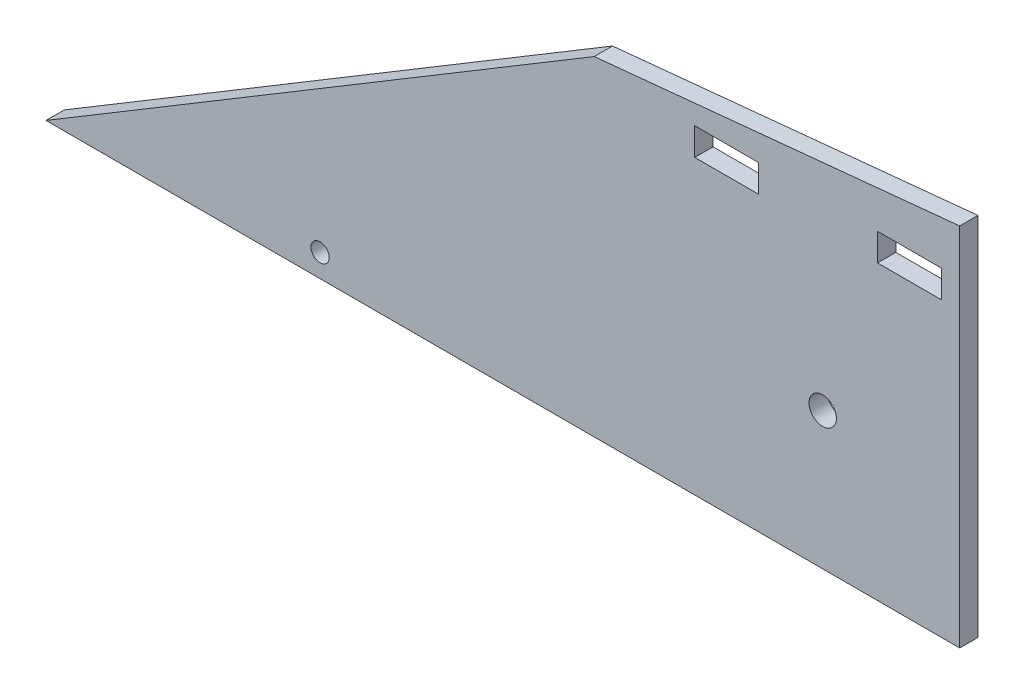
ISO-10303-21;
HEADER;
FILE_DESCRIPTION(('STEP AP214'),'2;1');
FILE_NAME('part.step','',(''),(''),'','','');
FILE_SCHEMA(('AUTOMOTIVE_DESIGN { 1 0 10303 214 1 1 1 1 }'));
ENDSEC;
DATA;
#1=APPLICATION_CONTEXT('core data for automotive mechanical design processes');
#2=APPLICATION_PROTOCOL_DEFINITION('international standard','automotive_design',2000,#1);
#3=PRODUCT_CONTEXT('',#1,'mechanical');
#4=PRODUCT('Part','Part','',(#3));
#5=PRODUCT_RELATED_PRODUCT_CATEGORY('part','',(#4));
#6=PRODUCT_DEFINITION_FORMATION('','',#4);
#7=PRODUCT_DEFINITION_CONTEXT('part definition',#1,'design');
#8=PRODUCT_DEFINITION('design','',#6,#7);
#9=PRODUCT_DEFINITION_SHAPE('','',#8);
#10=(LENGTH_UNIT() NAMED_UNIT(*) SI_UNIT(.MILLI.,.METRE.));
#11=(NAMED_UNIT(*) PLANE_ANGLE_UNIT() SI_UNIT($,.RADIAN.));
#12=(NAMED_UNIT(*) SI_UNIT($,.STERADIAN.) SOLID_ANGLE_UNIT());
#13=UNCERTAINTY_MEASURE_WITH_UNIT(LENGTH_MEASURE(1.E-05),#10,'distance_accuracy_value','');
#14=(GEOMETRIC_REPRESENTATION_CONTEXT(3) GLOBAL_UNCERTAINTY_ASSIGNED_CONTEXT((#13)) GLOBAL_UNIT_ASSIGNED_CONTEXT((#10,
#11,#12)) REPRESENTATION_CONTEXT('',''));
#15=CARTESIAN_POINT('',(0.,0.,0.));
#16=DIRECTION('',(0.,0.,1.));
#17=DIRECTION('',(1.,0.,0.));
#18=AXIS2_PLACEMENT_3D('',#15,#16,#17);
#19=CARTESIAN_POINT('',(61.3646568793058,600.925212577331,20.));
#20=DIRECTION('',(0.,0.,-1.));
#21=DIRECTION('',(-1.,0.,0.));
#22=AXIS2_PLACEMENT_3D('',#19,#20,#21);
#23=PLANE('',#22);
#24=CARTESIAN_POINT('',(-638.635343120694,25.,20.));
#25=DIRECTION('',(0.,0.,-1.));
#26=DIRECTION('',(-1.,0.,0.));
#27=AXIS2_PLACEMENT_3D('',#24,#25,#26);
#28=CIRCLE('',#27,9.99999999999998);
#29=CARTESIAN_POINT('',(-648.635343120694,25.,20.));
#30=VERTEX_POINT('',#29);
#31=EDGE_CURVE('E156',#30,#30,#28,.T.);
#32=ORIENTED_EDGE('',*,*,#31,.T.);
#33=EDGE_LOOP('',(#32));
#34=FACE_BOUND('',#33,.T.);
#35=CARTESIAN_POINT('',(-88.6353431206942,150.,20.));
#36=DIRECTION('',(0.,0.,-1.));
#37=DIRECTION('',(-1.,0.,0.));
#38=AXIS2_PLACEMENT_3D('',#35,#36,#37);
#39=CIRCLE('',#38,15.);
#40=CARTESIAN_POINT('',(-103.635343120694,150.,20.));
#41=VERTEX_POINT('',#40);
#42=EDGE_CURVE('E196',#41,#41,#39,.T.);
#43=ORIENTED_EDGE('',*,*,#42,.T.);
#44=EDGE_LOOP('',(#43));
#45=FACE_BOUND('',#44,.T.);
#46=DIRECTION('',(-0.857142857142857,-0.515078753637713,0.));
#47=VECTOR('',#46,1.);
#48=CARTESIAN_POINT('',(-338.635343120694,360.555127546399,20.));
#49=LINE('',#48,#47);
#50=CARTESIAN_POINT('',(-338.635343120694,360.555127546399,20.));
#51=VERTEX_POINT('',#50);
#52=CARTESIAN_POINT('',(-938.635343120694,0.,20.));
#53=VERTEX_POINT('',#52);
#54=EDGE_CURVE('E200',#51,#53,#49,.T.);
#55=ORIENTED_EDGE('',*,*,#54,.T.);
#56=DIRECTION('',(1.,0.,0.));
#57=VECTOR('',#56,1.);
#58=CARTESIAN_POINT('',(-938.635343120694,0.,20.));
#59=LINE('',#58,#57);
#60=CARTESIAN_POINT('',(61.3646568793058,0.,20.));
#61=VERTEX_POINT('',#60);
#62=EDGE_CURVE('E203',#53,#61,#59,.T.);
#63=ORIENTED_EDGE('',*,*,#62,.T.);
#64=DIRECTION('',(0.,1.,0.));
#65=VECTOR('',#64,1.);
#66=CARTESIAN_POINT('',(61.3646568793058,0.,20.));
#67=LINE('',#66,#65);
#68=CARTESIAN_POINT('',(61.3646568793058,400.,20.));
#69=VERTEX_POINT('',#68);
#70=EDGE_CURVE('E206',#61,#69,#67,.T.);
#71=ORIENTED_EDGE('',*,*,#70,.T.);
#72=DIRECTION('',(-0.995172995133295,-0.0981361796557527,0.));
#73=VECTOR('',#72,1.);
#74=CARTESIAN_POINT('',(61.3646568793058,400.,20.));
#75=LINE('',#74,#73);
#76=EDGE_CURVE('E208',#69,#51,#75,.T.);
#77=ORIENTED_EDGE('',*,*,#76,.T.);
#78=EDGE_LOOP('',(#55,#63,#71,#77));
#79=FACE_BOUND('',#78,.T.);
#80=DIRECTION('',(1.,0.,0.));
#81=VECTOR('',#80,1.);
#82=CARTESIAN_POINT('',(-158.635343120694,350.,20.));
#83=LINE('',#82,#81);
#84=CARTESIAN_POINT('',(-228.635343120694,350.,20.));
#85=VERTEX_POINT('',#84);
#86=CARTESIAN_POINT('',(-158.635343120694,350.,20.));
#87=VERTEX_POINT('',#86);
#88=EDGE_CURVE('E165',#85,#87,#83,.T.);
#89=ORIENTED_EDGE('',*,*,#88,.T.);
#90=DIRECTION('',(0.,-1.,0.));
#91=VECTOR('',#90,1.);
#92=CARTESIAN_POINT('',(-158.635343120694,320.,20.));
#93=LINE('',#92,#91);
#94=CARTESIAN_POINT('',(-158.635343120694,320.,20.));
#95=VERTEX_POINT('',#94);
#96=EDGE_CURVE('E161',#87,#95,#93,.T.);
#97=ORIENTED_EDGE('',*,*,#96,.T.);
#98=DIRECTION('',(-1.,0.,0.));
#99=VECTOR('',#98,1.);
#100=CARTESIAN_POINT('',(-158.635343120694,320.,20.));
#101=LINE('',#100,#99);
#102=CARTESIAN_POINT('',(-228.635343120694,320.,20.));
#103=VERTEX_POINT('',#102);
#104=EDGE_CURVE('E164',#95,#103,#101,.T.);
#105=ORIENTED_EDGE('',*,*,#104,.T.);
#106=DIRECTION('',(0.,1.,0.));
#107=VECTOR('',#106,1.);
#108=CARTESIAN_POINT('',(-228.635343120694,320.,20.));
#109=LINE('',#108,#107);
#110=EDGE_CURVE('E168',#103,#85,#109,.T.);
#111=ORIENTED_EDGE('',*,*,#110,.T.);
#112=EDGE_LOOP('',(#89,#97,#105,#111));
#113=FACE_BOUND('',#112,.T.);
#114=DIRECTION('',(-1.,0.,0.));
#115=VECTOR('',#114,1.);
#116=CARTESIAN_POINT('',(-28.6353431206942,320.,20.));
#117=LINE('',#116,#115);
#118=CARTESIAN_POINT('',(41.3646568793058,320.,20.));
#119=VERTEX_POINT('',#118);
#120=CARTESIAN_POINT('',(-28.6353431206942,320.,20.));
#121=VERTEX_POINT('',#120);
#122=EDGE_CURVE('E149',#119,#121,#117,.T.);
#123=ORIENTED_EDGE('',*,*,#122,.T.);
#124=DIRECTION('',(0.,1.,0.));
#125=VECTOR('',#124,1.);
#126=CARTESIAN_POINT('',(-28.6353431206942,320.,20.));
#127=LINE('',#126,#125);
#128=CARTESIAN_POINT('',(-28.6353431206942,350.,20.));
#129=VERTEX_POINT('',#128);
#130=EDGE_CURVE('E152',#121,#129,#127,.T.);
#131=ORIENTED_EDGE('',*,*,#130,.T.);
#132=DIRECTION('',(1.,0.,0.));
#133=VECTOR('',#132,1.);
#134=CARTESIAN_POINT('',(-28.6353431206942,350.,20.));
#135=LINE('',#134,#133);
#136=CARTESIAN_POINT('',(41.3646568793058,350.,20.));
#137=VERTEX_POINT('',#136);
#138=EDGE_CURVE('E123',#129,#137,#135,.T.);
#139=ORIENTED_EDGE('',*,*,#138,.T.);
#140=DIRECTION('',(0.,-1.,0.));
#141=VECTOR('',#140,1.);
#142=CARTESIAN_POINT('',(41.3646568793058,320.,20.));
#143=LINE('',#142,#141);
#144=EDGE_CURVE('E157',#137,#119,#143,.T.);
#145=ORIENTED_EDGE('',*,*,#144,.T.);
#146=EDGE_LOOP('',(#123,#131,#139,#145));
#147=FACE_BOUND('',#146,.T.);
#148=ADVANCED_FACE('F31',(#34,#45,#79,#113,#147),#23,.F.);
#149=CARTESIAN_POINT('',(61.3646568793058,600.925212577331,0.));
#150=DIRECTION('',(0.,0.,-1.));
#151=DIRECTION('',(-1.,0.,0.));
#152=AXIS2_PLACEMENT_3D('',#149,#150,#151);
#153=PLANE('',#152);
#154=CARTESIAN_POINT('',(-638.635343120694,25.,0.));
#155=DIRECTION('',(0.,0.,1.));
#156=DIRECTION('',(1.,0.,0.));
#157=AXIS2_PLACEMENT_3D('',#154,#155,#156);
#158=CIRCLE('',#157,9.99999999999998);
#159=CARTESIAN_POINT('',(-628.635343120694,25.,0.));
#160=VERTEX_POINT('',#159);
#161=EDGE_CURVE('E153',#160,#160,#158,.T.);
#162=ORIENTED_EDGE('',*,*,#161,.T.);
#163=EDGE_LOOP('',(#162));
#164=FACE_BOUND('',#163,.T.);
#165=CARTESIAN_POINT('',(-88.6353431206942,150.,0.));
#166=DIRECTION('',(0.,0.,1.));
#167=DIRECTION('',(1.,0.,0.));
#168=AXIS2_PLACEMENT_3D('',#165,#166,#167);
#169=CIRCLE('',#168,15.);
#170=CARTESIAN_POINT('',(-73.6353431206942,150.,0.));
#171=VERTEX_POINT('',#170);
#172=EDGE_CURVE('E171',#171,#171,#169,.T.);
#173=ORIENTED_EDGE('',*,*,#172,.T.);
#174=EDGE_LOOP('',(#173));
#175=FACE_BOUND('',#174,.T.);
#176=DIRECTION('',(-0.857142857142857,-0.515078753637713,0.));
#177=VECTOR('',#176,1.);
#178=CARTESIAN_POINT('',(-338.635343120694,360.555127546399,0.));
#179=LINE('',#178,#177);
#180=CARTESIAN_POINT('',(-338.635343120694,360.555127546399,0.));
#181=VERTEX_POINT('',#180);
#182=CARTESIAN_POINT('',(-938.635343120694,0.,0.));
#183=VERTEX_POINT('',#182);
#184=EDGE_CURVE('E199',#181,#183,#179,.T.);
#185=ORIENTED_EDGE('',*,*,#184,.F.);
#186=DIRECTION('',(-0.995172995133295,-0.0981361796557527,0.));
#187=VECTOR('',#186,1.);
#188=CARTESIAN_POINT('',(61.3646568793058,400.,0.));
#189=LINE('',#188,#187);
#190=CARTESIAN_POINT('',(61.3646568793058,400.,0.));
#191=VERTEX_POINT('',#190);
#192=EDGE_CURVE('E204',#191,#181,#189,.T.);
#193=ORIENTED_EDGE('',*,*,#192,.F.);
#194=DIRECTION('',(0.,1.,0.));
#195=VECTOR('',#194,1.);
#196=CARTESIAN_POINT('',(61.3646568793058,0.,0.));
#197=LINE('',#196,#195);
#198=CARTESIAN_POINT('',(61.3646568793058,0.,0.));
#199=VERTEX_POINT('',#198);
#200=EDGE_CURVE('E215',#199,#191,#197,.T.);
#201=ORIENTED_EDGE('',*,*,#200,.F.);
#202=DIRECTION('',(1.,0.,0.));
#203=VECTOR('',#202,1.);
#204=CARTESIAN_POINT('',(-938.635343120694,0.,0.));
#205=LINE('',#204,#203);
#206=EDGE_CURVE('E213',#183,#199,#205,.T.);
#207=ORIENTED_EDGE('',*,*,#206,.F.);
#208=EDGE_LOOP('',(#185,#193,#201,#207));
#209=FACE_BOUND('',#208,.T.);
#210=DIRECTION('',(0.,1.,0.));
#211=VECTOR('',#210,1.);
#212=CARTESIAN_POINT('',(-158.635343120694,320.,0.));
#213=LINE('',#212,#211);
#214=CARTESIAN_POINT('',(-158.635343120694,320.,0.));
#215=VERTEX_POINT('',#214);
#216=CARTESIAN_POINT('',(-158.635343120694,350.,0.));
#217=VERTEX_POINT('',#216);
#218=EDGE_CURVE('E177',#215,#217,#213,.T.);
#219=ORIENTED_EDGE('',*,*,#218,.T.);
#220=DIRECTION('',(-1.,0.,0.));
#221=VECTOR('',#220,1.);
#222=CARTESIAN_POINT('',(-158.635343120694,350.,0.));
#223=LINE('',#222,#221);
#224=CARTESIAN_POINT('',(-228.635343120694,350.,0.));
#225=VERTEX_POINT('',#224);
#226=EDGE_CURVE('E180',#217,#225,#223,.T.);
#227=ORIENTED_EDGE('',*,*,#226,.T.);
#228=DIRECTION('',(0.,-1.,0.));
#229=VECTOR('',#228,1.);
#230=CARTESIAN_POINT('',(-228.635343120694,320.,0.));
#231=LINE('',#230,#229);
#232=CARTESIAN_POINT('',(-228.635343120694,320.,0.));
#233=VERTEX_POINT('',#232);
#234=EDGE_CURVE('E160',#225,#233,#231,.T.);
#235=ORIENTED_EDGE('',*,*,#234,.T.);
#236=DIRECTION('',(1.,0.,0.));
#237=VECTOR('',#236,1.);
#238=CARTESIAN_POINT('',(-158.635343120694,320.,0.));
#239=LINE('',#238,#237);
#240=EDGE_CURVE('E174',#233,#215,#239,.T.);
#241=ORIENTED_EDGE('',*,*,#240,.T.);
#242=EDGE_LOOP('',(#219,#227,#235,#241));
#243=FACE_BOUND('',#242,.T.);
#244=DIRECTION('',(0.,-1.,0.));
#245=VECTOR('',#244,1.);
#246=CARTESIAN_POINT('',(-28.6353431206942,320.,0.));
#247=LINE('',#246,#245);
#248=CARTESIAN_POINT('',(-28.6353431206942,350.,0.));
#249=VERTEX_POINT('',#248);
#250=CARTESIAN_POINT('',(-28.6353431206942,320.,0.));
#251=VERTEX_POINT('',#250);
#252=EDGE_CURVE('E130',#249,#251,#247,.T.);
#253=ORIENTED_EDGE('',*,*,#252,.T.);
#254=DIRECTION('',(1.,0.,0.));
#255=VECTOR('',#254,1.);
#256=CARTESIAN_POINT('',(-28.6353431206942,320.,0.));
#257=LINE('',#256,#255);
#258=CARTESIAN_POINT('',(41.3646568793058,320.,0.));
#259=VERTEX_POINT('',#258);
#260=EDGE_CURVE('E136',#251,#259,#257,.T.);
#261=ORIENTED_EDGE('',*,*,#260,.T.);
#262=DIRECTION('',(0.,1.,0.));
#263=VECTOR('',#262,1.);
#264=CARTESIAN_POINT('',(41.3646568793058,320.,0.));
#265=LINE('',#264,#263);
#266=CARTESIAN_POINT('',(41.3646568793058,350.,0.));
#267=VERTEX_POINT('',#266);
#268=EDGE_CURVE('E140',#259,#267,#265,.T.);
#269=ORIENTED_EDGE('',*,*,#268,.T.);
#270=DIRECTION('',(-1.,0.,0.));
#271=VECTOR('',#270,1.);
#272=CARTESIAN_POINT('',(-28.6353431206942,350.,0.));
#273=LINE('',#272,#271);
#274=EDGE_CURVE('E54',#267,#249,#273,.T.);
#275=ORIENTED_EDGE('',*,*,#274,.T.);
#276=EDGE_LOOP('',(#253,#261,#269,#275));
#277=FACE_BOUND('',#276,.T.);
#278=ADVANCED_FACE('F139',(#164,#175,#209,#243,#277),#153,.T.);
#279=CARTESIAN_POINT('',(-338.635343120694,360.555127546399,20.));
#280=DIRECTION('',(0.515078753637713,-0.857142857142857,0.));
#281=DIRECTION('',(0.857142857142857,0.515078753637713,0.));
#282=AXIS2_PLACEMENT_3D('',#279,#280,#281);
#283=PLANE('',#282);
#284=ORIENTED_EDGE('',*,*,#184,.T.);
#285=DIRECTION('',(0.,0.,-1.));
#286=VECTOR('',#285,1.);
#287=CARTESIAN_POINT('',(-938.635343120694,0.,20.));
#288=LINE('',#287,#286);
#289=EDGE_CURVE('E11',#53,#183,#288,.T.);
#290=ORIENTED_EDGE('',*,*,#289,.F.);
#291=ORIENTED_EDGE('',*,*,#54,.F.);
#292=DIRECTION('',(0.,0.,-1.));
#293=VECTOR('',#292,1.);
#294=CARTESIAN_POINT('',(-338.635343120694,360.555127546399,20.));
#295=LINE('',#294,#293);
#296=EDGE_CURVE('E210',#51,#181,#295,.T.);
#297=ORIENTED_EDGE('',*,*,#296,.T.);
#298=EDGE_LOOP('',(#284,#290,#291,#297));
#299=FACE_BOUND('',#298,.T.);
#300=ADVANCED_FACE('F33',(#299),#283,.F.);
#301=CARTESIAN_POINT('',(-938.635343120694,0.,20.));
#302=DIRECTION('',(0.,1.,0.));
#303=DIRECTION('',(0.,0.,1.));
#304=AXIS2_PLACEMENT_3D('',#301,#302,#303);
#305=PLANE('',#304);
#306=ORIENTED_EDGE('',*,*,#206,.T.);
#307=DIRECTION('',(0.,0.,-1.));
#308=VECTOR('',#307,1.);
#309=CARTESIAN_POINT('',(61.3646568793058,0.,20.));
#310=LINE('',#309,#308);
#311=EDGE_CURVE('E39',#61,#199,#310,.T.);
#312=ORIENTED_EDGE('',*,*,#311,.F.);
#313=ORIENTED_EDGE('',*,*,#62,.F.);
#314=ORIENTED_EDGE('',*,*,#289,.T.);
#315=EDGE_LOOP('',(#306,#312,#313,#314));
#316=FACE_BOUND('',#315,.T.);
#317=ADVANCED_FACE('F243',(#316),#305,.F.);
#318=CARTESIAN_POINT('',(61.3646568793058,0.,20.));
#319=DIRECTION('',(-1.,0.,0.));
#320=DIRECTION('',(0.,0.,1.));
#321=AXIS2_PLACEMENT_3D('',#318,#319,#320);
#322=PLANE('',#321);
#323=ORIENTED_EDGE('',*,*,#200,.T.);
#324=DIRECTION('',(0.,0.,-1.));
#325=VECTOR('',#324,1.);
#326=CARTESIAN_POINT('',(61.3646568793058,400.,20.));
#327=LINE('',#326,#325);
#328=EDGE_CURVE('E220',#69,#191,#327,.T.);
#329=ORIENTED_EDGE('',*,*,#328,.F.);
#330=ORIENTED_EDGE('',*,*,#70,.F.);
#331=ORIENTED_EDGE('',*,*,#311,.T.);
#332=EDGE_LOOP('',(#323,#329,#330,#331));
#333=FACE_BOUND('',#332,.T.);
#334=ADVANCED_FACE('F227',(#333),#322,.F.);
#335=CARTESIAN_POINT('',(61.3646568793058,400.,20.));
#336=DIRECTION('',(0.0981361796557527,-0.995172995133295,0.));
#337=DIRECTION('',(0.995172995133295,0.0981361796557528,0.));
#338=AXIS2_PLACEMENT_3D('',#335,#336,#337);
#339=PLANE('',#338);
#340=ORIENTED_EDGE('',*,*,#192,.T.);
#341=ORIENTED_EDGE('',*,*,#296,.F.);
#342=ORIENTED_EDGE('',*,*,#76,.F.);
#343=ORIENTED_EDGE('',*,*,#328,.T.);
#344=EDGE_LOOP('',(#340,#341,#342,#343));
#345=FACE_BOUND('',#344,.T.);
#346=ADVANCED_FACE('F236',(#345),#339,.F.);
#347=CARTESIAN_POINT('',(-88.6353431206942,150.,96.1577310586391));
#348=DIRECTION('',(0.,0.,-1.));
#349=DIRECTION('',(-1.,0.,0.));
#350=AXIS2_PLACEMENT_3D('',#347,#348,#349);
#351=CYLINDRICAL_SURFACE('',#350,15.);
#352=ORIENTED_EDGE('',*,*,#42,.F.);
#353=EDGE_LOOP('',(#352));
#354=FACE_BOUND('',#353,.T.);
#355=ORIENTED_EDGE('',*,*,#172,.F.);
#356=EDGE_LOOP('',(#355));
#357=FACE_BOUND('',#356,.T.);
#358=ADVANCED_FACE('F260',(#354,#357),#351,.F.);
#359=CARTESIAN_POINT('',(-158.635343120694,350.,96.1577310586391));
#360=DIRECTION('',(0.,-1.,0.));
#361=DIRECTION('',(0.,0.,-1.));
#362=AXIS2_PLACEMENT_3D('',#359,#360,#361);
#363=PLANE('',#362);
#364=DIRECTION('',(0.,0.,-1.));
#365=VECTOR('',#364,1.);
#366=CARTESIAN_POINT('',(-228.635343120694,350.,96.1577310586391));
#367=LINE('',#366,#365);
#368=EDGE_CURVE('E183',#85,#225,#367,.T.);
#369=ORIENTED_EDGE('',*,*,#368,.T.);
#370=ORIENTED_EDGE('',*,*,#226,.F.);
#371=DIRECTION('',(0.,0.,-1.));
#372=VECTOR('',#371,1.);
#373=CARTESIAN_POINT('',(-158.635343120694,350.,96.1577310586391));
#374=LINE('',#373,#372);
#375=EDGE_CURVE('E185',#87,#217,#374,.T.);
#376=ORIENTED_EDGE('',*,*,#375,.F.);
#377=ORIENTED_EDGE('',*,*,#88,.F.);
#378=EDGE_LOOP('',(#369,#370,#376,#377));
#379=FACE_BOUND('',#378,.T.);
#380=ADVANCED_FACE('F267',(#379),#363,.T.);
#381=CARTESIAN_POINT('',(-158.635343120694,320.,96.1577310586391));
#382=DIRECTION('',(-1.,0.,0.));
#383=DIRECTION('',(0.,0.,1.));
#384=AXIS2_PLACEMENT_3D('',#381,#382,#383);
#385=PLANE('',#384);
#386=ORIENTED_EDGE('',*,*,#375,.T.);
#387=ORIENTED_EDGE('',*,*,#218,.F.);
#388=DIRECTION('',(0.,0.,-1.));
#389=VECTOR('',#388,1.);
#390=CARTESIAN_POINT('',(-158.635343120694,320.,96.1577310586391));
#391=LINE('',#390,#389);
#392=EDGE_CURVE('E187',#95,#215,#391,.T.);
#393=ORIENTED_EDGE('',*,*,#392,.F.);
#394=ORIENTED_EDGE('',*,*,#96,.F.);
#395=EDGE_LOOP('',(#386,#387,#393,#394));
#396=FACE_BOUND('',#395,.T.);
#397=ADVANCED_FACE('F272',(#396),#385,.T.);
#398=CARTESIAN_POINT('',(-158.635343120694,320.,96.1577310586391));
#399=DIRECTION('',(0.,1.,0.));
#400=DIRECTION('',(-1.,0.,0.));
#401=AXIS2_PLACEMENT_3D('',#398,#399,#400);
#402=PLANE('',#401);
#403=ORIENTED_EDGE('',*,*,#392,.T.);
#404=ORIENTED_EDGE('',*,*,#240,.F.);
#405=DIRECTION('',(0.,0.,-1.));
#406=VECTOR('',#405,1.);
#407=CARTESIAN_POINT('',(-228.635343120694,320.,96.1577310586391));
#408=LINE('',#407,#406);
#409=EDGE_CURVE('E189',#103,#233,#408,.T.);
#410=ORIENTED_EDGE('',*,*,#409,.F.);
#411=ORIENTED_EDGE('',*,*,#104,.F.);
#412=EDGE_LOOP('',(#403,#404,#410,#411));
#413=FACE_BOUND('',#412,.T.);
#414=ADVANCED_FACE('F282',(#413),#402,.T.);
#415=CARTESIAN_POINT('',(-228.635343120694,320.,96.1577310586391));
#416=DIRECTION('',(1.,0.,0.));
#417=DIRECTION('',(0.,0.,-1.));
#418=AXIS2_PLACEMENT_3D('',#415,#416,#417);
#419=PLANE('',#418);
#420=ORIENTED_EDGE('',*,*,#409,.T.);
#421=ORIENTED_EDGE('',*,*,#234,.F.);
#422=ORIENTED_EDGE('',*,*,#368,.F.);
#423=ORIENTED_EDGE('',*,*,#110,.F.);
#424=EDGE_LOOP('',(#420,#421,#422,#423));
#425=FACE_BOUND('',#424,.T.);
#426=ADVANCED_FACE('F290',(#425),#419,.T.);
#427=CARTESIAN_POINT('',(-638.635343120694,25.,96.1577310586391));
#428=DIRECTION('',(0.,0.,-1.));
#429=DIRECTION('',(-1.,0.,0.));
#430=AXIS2_PLACEMENT_3D('',#427,#428,#429);
#431=CYLINDRICAL_SURFACE('',#430,9.99999999999998);
#432=ORIENTED_EDGE('',*,*,#31,.F.);
#433=EDGE_LOOP('',(#432));
#434=FACE_BOUND('',#433,.T.);
#435=ORIENTED_EDGE('',*,*,#161,.F.);
#436=EDGE_LOOP('',(#435));
#437=FACE_BOUND('',#436,.T.);
#438=ADVANCED_FACE('F286',(#434,#437),#431,.F.);
#439=CARTESIAN_POINT('',(-28.6353431206942,320.,96.1577310586391));
#440=DIRECTION('',(0.,1.,0.));
#441=DIRECTION('',(0.,0.,1.));
#442=AXIS2_PLACEMENT_3D('',#439,#440,#441);
#443=PLANE('',#442);
#444=DIRECTION('',(0.,0.,-1.));
#445=VECTOR('',#444,1.);
#446=CARTESIAN_POINT('',(41.3646568793058,320.,96.1577310586391));
#447=LINE('',#446,#445);
#448=EDGE_CURVE('E46',#119,#259,#447,.T.);
#449=ORIENTED_EDGE('',*,*,#448,.T.);
#450=ORIENTED_EDGE('',*,*,#260,.F.);
#451=DIRECTION('',(0.,0.,-1.));
#452=VECTOR('',#451,1.);
#453=CARTESIAN_POINT('',(-28.6353431206942,320.,96.1577310586391));
#454=LINE('',#453,#452);
#455=EDGE_CURVE('E127',#121,#251,#454,.T.);
#456=ORIENTED_EDGE('',*,*,#455,.F.);
#457=ORIENTED_EDGE('',*,*,#122,.F.);
#458=EDGE_LOOP('',(#449,#450,#456,#457));
#459=FACE_BOUND('',#458,.T.);
#460=ADVANCED_FACE('F297',(#459),#443,.T.);
#461=CARTESIAN_POINT('',(-28.6353431206942,320.,96.1577310586391));
#462=DIRECTION('',(1.,0.,0.));
#463=DIRECTION('',(0.,0.,-1.));
#464=AXIS2_PLACEMENT_3D('',#461,#462,#463);
#465=PLANE('',#464);
#466=ORIENTED_EDGE('',*,*,#455,.T.);
#467=ORIENTED_EDGE('',*,*,#252,.F.);
#468=DIRECTION('',(0.,0.,-1.));
#469=VECTOR('',#468,1.);
#470=CARTESIAN_POINT('',(-28.6353431206942,350.,96.1577310586391));
#471=LINE('',#470,#469);
#472=EDGE_CURVE('E119',#129,#249,#471,.T.);
#473=ORIENTED_EDGE('',*,*,#472,.F.);
#474=ORIENTED_EDGE('',*,*,#130,.F.);
#475=EDGE_LOOP('',(#466,#467,#473,#474));
#476=FACE_BOUND('',#475,.T.);
#477=ADVANCED_FACE('F131',(#476),#465,.T.);
#478=CARTESIAN_POINT('',(-28.6353431206942,350.,96.1577310586391));
#479=DIRECTION('',(0.,-1.,0.));
#480=DIRECTION('',(0.,0.,-1.));
#481=AXIS2_PLACEMENT_3D('',#478,#479,#480);
#482=PLANE('',#481);
#483=ORIENTED_EDGE('',*,*,#472,.T.);
#484=ORIENTED_EDGE('',*,*,#274,.F.);
#485=DIRECTION('',(0.,0.,-1.));
#486=VECTOR('',#485,1.);
#487=CARTESIAN_POINT('',(41.3646568793058,350.,96.1577310586391));
#488=LINE('',#487,#486);
#489=EDGE_CURVE('E126',#137,#267,#488,.T.);
#490=ORIENTED_EDGE('',*,*,#489,.F.);
#491=ORIENTED_EDGE('',*,*,#138,.F.);
#492=EDGE_LOOP('',(#483,#484,#490,#491));
#493=FACE_BOUND('',#492,.T.);
#494=ADVANCED_FACE('F121',(#493),#482,.T.);
#495=CARTESIAN_POINT('',(41.3646568793058,320.,96.1577310586391));
#496=DIRECTION('',(-1.,0.,0.));
#497=DIRECTION('',(0.,0.,1.));
#498=AXIS2_PLACEMENT_3D('',#495,#496,#497);
#499=PLANE('',#498);
#500=ORIENTED_EDGE('',*,*,#489,.T.);
#501=ORIENTED_EDGE('',*,*,#268,.F.);
#502=ORIENTED_EDGE('',*,*,#448,.F.);
#503=ORIENTED_EDGE('',*,*,#144,.F.);
#504=EDGE_LOOP('',(#500,#501,#502,#503));
#505=FACE_BOUND('',#504,.T.);
#506=ADVANCED_FACE('F309',(#505),#499,.T.);
#507=CLOSED_SHELL('',(#148,#278,#300,#317,#334,#346,#358,#380,#397,#414,#426,#438,#460,#477,
#494,#506));
#508=MANIFOLD_SOLID_BREP('B2',#507);
#509=ADVANCED_BREP_SHAPE_REPRESENTATION('',(#18,#508),#14);
#510=SHAPE_DEFINITION_REPRESENTATION(#9,#509);
ENDSEC;
END-ISO-10303-21;
